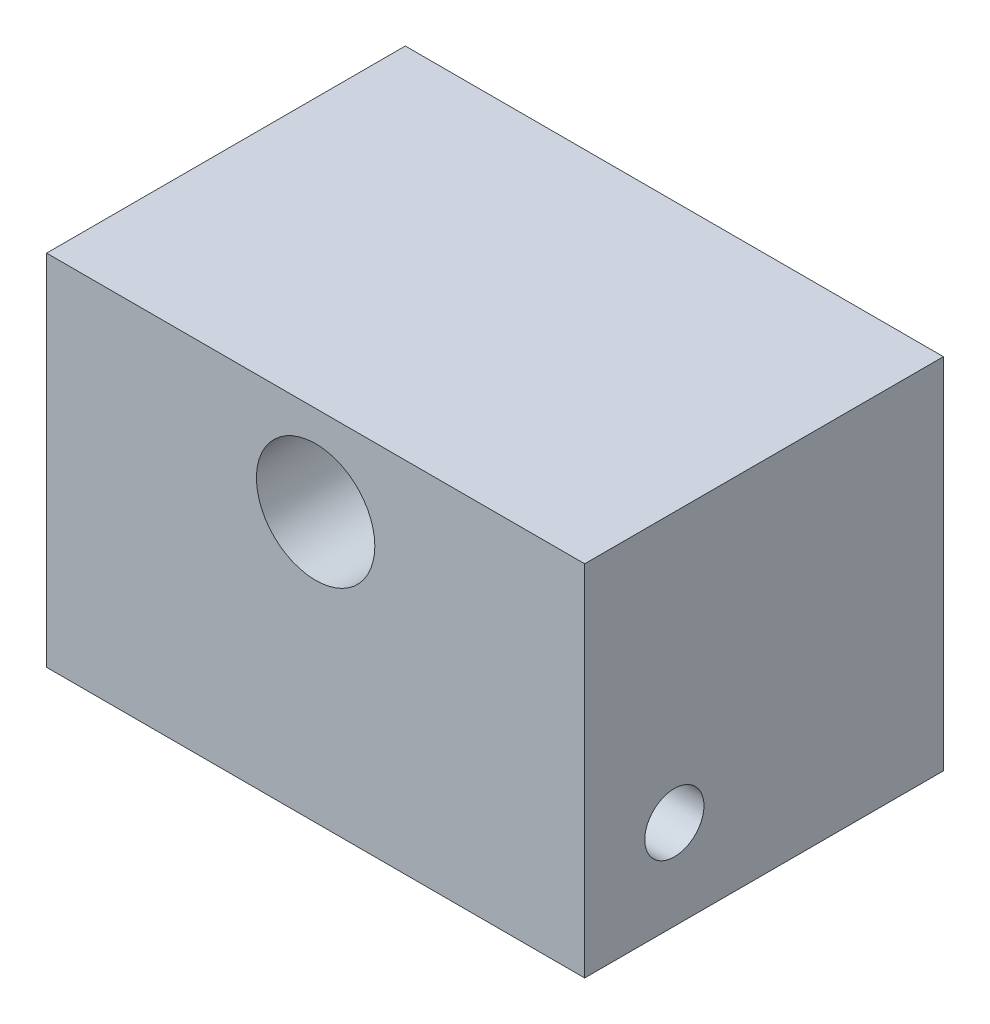
ISO-10303-21;
HEADER;
FILE_DESCRIPTION(('STEP AP214'),'2;1');
FILE_NAME('part.step','',(''),(''),'','','');
FILE_SCHEMA(('AUTOMOTIVE_DESIGN { 1 0 10303 214 1 1 1 1 }'));
ENDSEC;
DATA;
#1=APPLICATION_CONTEXT('core data for automotive mechanical design processes');
#2=APPLICATION_PROTOCOL_DEFINITION('international standard','automotive_design',2000,#1);
#3=PRODUCT_CONTEXT('',#1,'mechanical');
#4=PRODUCT('Part','Part','',(#3));
#5=PRODUCT_RELATED_PRODUCT_CATEGORY('part','',(#4));
#6=PRODUCT_DEFINITION_FORMATION('','',#4);
#7=PRODUCT_DEFINITION_CONTEXT('part definition',#1,'design');
#8=PRODUCT_DEFINITION('design','',#6,#7);
#9=PRODUCT_DEFINITION_SHAPE('','',#8);
#10=(LENGTH_UNIT() NAMED_UNIT(*) SI_UNIT(.MILLI.,.METRE.));
#11=(NAMED_UNIT(*) PLANE_ANGLE_UNIT() SI_UNIT($,.RADIAN.));
#12=(NAMED_UNIT(*) SI_UNIT($,.STERADIAN.) SOLID_ANGLE_UNIT());
#13=UNCERTAINTY_MEASURE_WITH_UNIT(LENGTH_MEASURE(1.E-05),#10,'distance_accuracy_value','');
#14=(GEOMETRIC_REPRESENTATION_CONTEXT(3) GLOBAL_UNCERTAINTY_ASSIGNED_CONTEXT((#13)) GLOBAL_UNIT_ASSIGNED_CONTEXT((#10,
#11,#12)) REPRESENTATION_CONTEXT('',''));
#15=CARTESIAN_POINT('',(0.,0.,0.));
#16=DIRECTION('',(0.,0.,1.));
#17=DIRECTION('',(1.,0.,0.));
#18=AXIS2_PLACEMENT_3D('',#15,#16,#17);
#19=CARTESIAN_POINT('',(0.,0.,20.));
#20=DIRECTION('',(1.,0.,0.));
#21=DIRECTION('',(0.,0.,-1.));
#22=AXIS2_PLACEMENT_3D('',#19,#20,#21);
#23=PLANE('',#22);
#24=CARTESIAN_POINT('',(0.,5.,15.));
#25=DIRECTION('',(-1.,0.,0.));
#26=DIRECTION('',(0.,0.,1.));
#27=AXIS2_PLACEMENT_3D('',#24,#25,#26);
#28=CIRCLE('',#27,1.65);
#29=CARTESIAN_POINT('',(0.,5.,16.65));
#30=VERTEX_POINT('',#29);
#31=EDGE_CURVE('E190',#30,#30,#28,.T.);
#32=ORIENTED_EDGE('',*,*,#31,.F.);
#33=EDGE_LOOP('',(#32));
#34=FACE_BOUND('',#33,.T.);
#35=DIRECTION('',(0.,-1.,0.));
#36=VECTOR('',#35,1.);
#37=CARTESIAN_POINT('',(0.,0.,0.));
#38=LINE('',#37,#36);
#39=CARTESIAN_POINT('',(0.,20.,0.));
#40=VERTEX_POINT('',#39);
#41=CARTESIAN_POINT('',(0.,0.,0.));
#42=VERTEX_POINT('',#41);
#43=EDGE_CURVE('E132',#40,#42,#38,.T.);
#44=ORIENTED_EDGE('',*,*,#43,.T.);
#45=DIRECTION('',(0.,0.,-1.));
#46=VECTOR('',#45,1.);
#47=CARTESIAN_POINT('',(0.,0.,20.));
#48=LINE('',#47,#46);
#49=CARTESIAN_POINT('',(0.,0.,20.));
#50=VERTEX_POINT('',#49);
#51=EDGE_CURVE('E11',#50,#42,#48,.T.);
#52=ORIENTED_EDGE('',*,*,#51,.F.);
#53=DIRECTION('',(0.,-1.,0.));
#54=VECTOR('',#53,1.);
#55=CARTESIAN_POINT('',(0.,0.,20.));
#56=LINE('',#55,#54);
#57=CARTESIAN_POINT('',(0.,20.,20.));
#58=VERTEX_POINT('',#57);
#59=EDGE_CURVE('E133',#58,#50,#56,.T.);
#60=ORIENTED_EDGE('',*,*,#59,.F.);
#61=DIRECTION('',(0.,0.,-1.));
#62=VECTOR('',#61,1.);
#63=CARTESIAN_POINT('',(0.,20.,20.));
#64=LINE('',#63,#62);
#65=EDGE_CURVE('E143',#58,#40,#64,.T.);
#66=ORIENTED_EDGE('',*,*,#65,.T.);
#67=EDGE_LOOP('',(#44,#52,#60,#66));
#68=FACE_BOUND('',#67,.T.);
#69=ADVANCED_FACE('F49',(#34,#68),#23,.F.);
#70=CARTESIAN_POINT('',(0.,0.,20.));
#71=DIRECTION('',(0.,1.,0.));
#72=DIRECTION('',(0.,0.,1.));
#73=AXIS2_PLACEMENT_3D('',#70,#71,#72);
#74=PLANE('',#73);
#75=CARTESIAN_POINT('',(22.5,0.,7.5));
#76=DIRECTION('',(0.,-1.,0.));
#77=DIRECTION('',(0.,0.,-1.));
#78=AXIS2_PLACEMENT_3D('',#75,#76,#77);
#79=CIRCLE('',#78,1.65);
#80=CARTESIAN_POINT('',(22.5,0.,5.85));
#81=VERTEX_POINT('',#80);
#82=EDGE_CURVE('E117',#81,#81,#79,.T.);
#83=ORIENTED_EDGE('',*,*,#82,.F.);
#84=EDGE_LOOP('',(#83));
#85=FACE_BOUND('',#84,.T.);
#86=CARTESIAN_POINT('',(7.5,0.,7.5));
#87=DIRECTION('',(0.,-1.,0.));
#88=DIRECTION('',(0.,0.,-1.));
#89=AXIS2_PLACEMENT_3D('',#86,#87,#88);
#90=CIRCLE('',#89,1.65);
#91=CARTESIAN_POINT('',(7.5,0.,5.85));
#92=VERTEX_POINT('',#91);
#93=EDGE_CURVE('E116',#92,#92,#90,.T.);
#94=ORIENTED_EDGE('',*,*,#93,.F.);
#95=EDGE_LOOP('',(#94));
#96=FACE_BOUND('',#95,.T.);
#97=DIRECTION('',(1.,0.,0.));
#98=VECTOR('',#97,1.);
#99=CARTESIAN_POINT('',(0.,0.,0.));
#100=LINE('',#99,#98);
#101=CARTESIAN_POINT('',(30.,0.,0.));
#102=VERTEX_POINT('',#101);
#103=EDGE_CURVE('E147',#42,#102,#100,.T.);
#104=ORIENTED_EDGE('',*,*,#103,.T.);
#105=DIRECTION('',(0.,0.,-1.));
#106=VECTOR('',#105,1.);
#107=CARTESIAN_POINT('',(30.,0.,20.));
#108=LINE('',#107,#106);
#109=CARTESIAN_POINT('',(30.,0.,20.));
#110=VERTEX_POINT('',#109);
#111=EDGE_CURVE('E59',#110,#102,#108,.T.);
#112=ORIENTED_EDGE('',*,*,#111,.F.);
#113=DIRECTION('',(1.,0.,0.));
#114=VECTOR('',#113,1.);
#115=CARTESIAN_POINT('',(0.,0.,20.));
#116=LINE('',#115,#114);
#117=EDGE_CURVE('E98',#50,#110,#116,.T.);
#118=ORIENTED_EDGE('',*,*,#117,.F.);
#119=ORIENTED_EDGE('',*,*,#51,.T.);
#120=EDGE_LOOP('',(#104,#112,#118,#119));
#121=FACE_BOUND('',#120,.T.);
#122=ADVANCED_FACE('F178',(#85,#96,#121),#74,.F.);
#123=CARTESIAN_POINT('',(30.,0.,20.));
#124=DIRECTION('',(-1.,0.,0.));
#125=DIRECTION('',(0.,0.,1.));
#126=AXIS2_PLACEMENT_3D('',#123,#124,#125);
#127=PLANE('',#126);
#128=CARTESIAN_POINT('',(30.,5.,15.));
#129=DIRECTION('',(1.,0.,0.));
#130=DIRECTION('',(0.,0.,-1.));
#131=AXIS2_PLACEMENT_3D('',#128,#129,#130);
#132=CIRCLE('',#131,1.65);
#133=CARTESIAN_POINT('',(30.,5.,13.35));
#134=VERTEX_POINT('',#133);
#135=EDGE_CURVE('E199',#134,#134,#132,.T.);
#136=ORIENTED_EDGE('',*,*,#135,.F.);
#137=EDGE_LOOP('',(#136));
#138=FACE_BOUND('',#137,.T.);
#139=DIRECTION('',(0.,1.,0.));
#140=VECTOR('',#139,1.);
#141=CARTESIAN_POINT('',(30.,0.,0.));
#142=LINE('',#141,#140);
#143=CARTESIAN_POINT('',(30.,20.,0.));
#144=VERTEX_POINT('',#143);
#145=EDGE_CURVE('E85',#102,#144,#142,.T.);
#146=ORIENTED_EDGE('',*,*,#145,.T.);
#147=DIRECTION('',(0.,0.,-1.));
#148=VECTOR('',#147,1.);
#149=CARTESIAN_POINT('',(30.,20.,20.));
#150=LINE('',#149,#148);
#151=CARTESIAN_POINT('',(30.,20.,20.));
#152=VERTEX_POINT('',#151);
#153=EDGE_CURVE('E156',#152,#144,#150,.T.);
#154=ORIENTED_EDGE('',*,*,#153,.F.);
#155=DIRECTION('',(0.,1.,0.));
#156=VECTOR('',#155,1.);
#157=CARTESIAN_POINT('',(30.,0.,20.));
#158=LINE('',#157,#156);
#159=EDGE_CURVE('E138',#110,#152,#158,.T.);
#160=ORIENTED_EDGE('',*,*,#159,.F.);
#161=ORIENTED_EDGE('',*,*,#111,.T.);
#162=EDGE_LOOP('',(#146,#154,#160,#161));
#163=FACE_BOUND('',#162,.T.);
#164=ADVANCED_FACE('F161',(#138,#163),#127,.F.);
#165=CARTESIAN_POINT('',(0.,20.,20.));
#166=DIRECTION('',(0.,-1.,0.));
#167=DIRECTION('',(0.,0.,-1.));
#168=AXIS2_PLACEMENT_3D('',#165,#166,#167);
#169=PLANE('',#168);
#170=DIRECTION('',(-1.,0.,0.));
#171=VECTOR('',#170,1.);
#172=CARTESIAN_POINT('',(0.,20.,0.));
#173=LINE('',#172,#171);
#174=EDGE_CURVE('E91',#144,#40,#173,.T.);
#175=ORIENTED_EDGE('',*,*,#174,.T.);
#176=ORIENTED_EDGE('',*,*,#65,.F.);
#177=DIRECTION('',(-1.,0.,0.));
#178=VECTOR('',#177,1.);
#179=CARTESIAN_POINT('',(0.,20.,20.));
#180=LINE('',#179,#178);
#181=EDGE_CURVE('E67',#152,#58,#180,.T.);
#182=ORIENTED_EDGE('',*,*,#181,.F.);
#183=ORIENTED_EDGE('',*,*,#153,.T.);
#184=EDGE_LOOP('',(#175,#176,#182,#183));
#185=FACE_BOUND('',#184,.T.);
#186=ADVANCED_FACE('F168',(#185),#169,.F.);
#187=CARTESIAN_POINT('',(0.,0.,20.));
#188=DIRECTION('',(0.,0.,-1.));
#189=DIRECTION('',(-1.,0.,0.));
#190=AXIS2_PLACEMENT_3D('',#187,#188,#189);
#191=PLANE('',#190);
#192=CARTESIAN_POINT('',(15.,15.,20.));
#193=DIRECTION('',(0.,0.,1.));
#194=DIRECTION('',(1.,0.,0.));
#195=AXIS2_PLACEMENT_3D('',#192,#193,#194);
#196=CIRCLE('',#195,3.29999999999999);
#197=CARTESIAN_POINT('',(18.3,15.,20.));
#198=VERTEX_POINT('',#197);
#199=EDGE_CURVE('E207',#198,#198,#196,.T.);
#200=ORIENTED_EDGE('',*,*,#199,.F.);
#201=EDGE_LOOP('',(#200));
#202=FACE_BOUND('',#201,.T.);
#203=ORIENTED_EDGE('',*,*,#59,.T.);
#204=ORIENTED_EDGE('',*,*,#117,.T.);
#205=ORIENTED_EDGE('',*,*,#159,.T.);
#206=ORIENTED_EDGE('',*,*,#181,.T.);
#207=EDGE_LOOP('',(#203,#204,#205,#206));
#208=FACE_BOUND('',#207,.T.);
#209=ADVANCED_FACE('F170',(#202,#208),#191,.F.);
#210=CARTESIAN_POINT('',(0.,0.,0.));
#211=DIRECTION('',(0.,0.,-1.));
#212=DIRECTION('',(-1.,0.,0.));
#213=AXIS2_PLACEMENT_3D('',#210,#211,#212);
#214=PLANE('',#213);
#215=CARTESIAN_POINT('',(15.,15.,0.));
#216=DIRECTION('',(0.,0.,1.));
#217=DIRECTION('',(1.,0.,0.));
#218=AXIS2_PLACEMENT_3D('',#215,#216,#217);
#219=CIRCLE('',#218,3.3);
#220=CARTESIAN_POINT('',(18.3,15.,0.));
#221=VERTEX_POINT('',#220);
#222=EDGE_CURVE('E125',#221,#221,#219,.T.);
#223=ORIENTED_EDGE('',*,*,#222,.T.);
#224=EDGE_LOOP('',(#223));
#225=FACE_BOUND('',#224,.T.);
#226=ORIENTED_EDGE('',*,*,#43,.F.);
#227=ORIENTED_EDGE('',*,*,#174,.F.);
#228=ORIENTED_EDGE('',*,*,#145,.F.);
#229=ORIENTED_EDGE('',*,*,#103,.F.);
#230=EDGE_LOOP('',(#226,#227,#228,#229));
#231=FACE_BOUND('',#230,.T.);
#232=ADVANCED_FACE('F164',(#225,#231),#214,.T.);
#233=CARTESIAN_POINT('',(7.5,10.5085799786045,7.5));
#234=DIRECTION('',(0.,-1.,0.));
#235=DIRECTION('',(0.,0.,-1.));
#236=AXIS2_PLACEMENT_3D('',#233,#234,#235);
#237=CONICAL_SURFACE('',#236,1.65,1.02974425867665);
#238=CARTESIAN_POINT('',(7.5,11.5,7.5));
#239=VERTEX_POINT('',#238);
#240=VERTEX_LOOP('',#239);
#241=FACE_BOUND('',#240,.T.);
#242=CARTESIAN_POINT('',(7.5,10.5085799786045,7.5));
#243=DIRECTION('',(0.,-1.,0.));
#244=DIRECTION('',(0.,0.,-1.));
#245=AXIS2_PLACEMENT_3D('',#242,#243,#244);
#246=CIRCLE('',#245,1.65);
#247=CARTESIAN_POINT('',(7.5,10.5085799786045,5.85));
#248=VERTEX_POINT('',#247);
#249=EDGE_CURVE('E122',#248,#248,#246,.T.);
#250=ORIENTED_EDGE('',*,*,#249,.T.);
#251=EDGE_LOOP('',(#250));
#252=FACE_BOUND('',#251,.T.);
#253=ADVANCED_FACE('F233',(#241,#252),#237,.F.);
#254=CARTESIAN_POINT('',(7.5,0.,7.5));
#255=DIRECTION('',(0.,-1.,0.));
#256=DIRECTION('',(0.,0.,-1.));
#257=AXIS2_PLACEMENT_3D('',#254,#255,#256);
#258=CYLINDRICAL_SURFACE('',#257,1.65);
#259=ORIENTED_EDGE('',*,*,#249,.F.);
#260=EDGE_LOOP('',(#259));
#261=FACE_BOUND('',#260,.T.);
#262=ORIENTED_EDGE('',*,*,#93,.T.);
#263=EDGE_LOOP('',(#262));
#264=FACE_BOUND('',#263,.T.);
#265=ADVANCED_FACE('F109',(#261,#264),#258,.F.);
#266=CARTESIAN_POINT('',(22.5,10.5085799786045,7.5));
#267=DIRECTION('',(0.,-1.,0.));
#268=DIRECTION('',(0.,0.,-1.));
#269=AXIS2_PLACEMENT_3D('',#266,#267,#268);
#270=CONICAL_SURFACE('',#269,1.65,1.02974425867665);
#271=CARTESIAN_POINT('',(22.5,11.5,7.5));
#272=VERTEX_POINT('',#271);
#273=VERTEX_LOOP('',#272);
#274=FACE_BOUND('',#273,.T.);
#275=CARTESIAN_POINT('',(22.5,10.5085799786045,7.5));
#276=DIRECTION('',(0.,-1.,0.));
#277=DIRECTION('',(0.,0.,-1.));
#278=AXIS2_PLACEMENT_3D('',#275,#276,#277);
#279=CIRCLE('',#278,1.65);
#280=CARTESIAN_POINT('',(22.5,10.5085799786045,5.85));
#281=VERTEX_POINT('',#280);
#282=EDGE_CURVE('E113',#281,#281,#279,.T.);
#283=ORIENTED_EDGE('',*,*,#282,.T.);
#284=EDGE_LOOP('',(#283));
#285=FACE_BOUND('',#284,.T.);
#286=ADVANCED_FACE('F105',(#274,#285),#270,.F.);
#287=CARTESIAN_POINT('',(22.5,0.,7.5));
#288=DIRECTION('',(0.,-1.,0.));
#289=DIRECTION('',(0.,0.,-1.));
#290=AXIS2_PLACEMENT_3D('',#287,#288,#289);
#291=CYLINDRICAL_SURFACE('',#290,1.65);
#292=ORIENTED_EDGE('',*,*,#282,.F.);
#293=EDGE_LOOP('',(#292));
#294=FACE_BOUND('',#293,.T.);
#295=ORIENTED_EDGE('',*,*,#82,.T.);
#296=EDGE_LOOP('',(#295));
#297=FACE_BOUND('',#296,.T.);
#298=ADVANCED_FACE('F108',(#294,#297),#291,.F.);
#299=CARTESIAN_POINT('',(15.,15.,20.));
#300=DIRECTION('',(0.,0.,1.));
#301=DIRECTION('',(1.,0.,0.));
#302=AXIS2_PLACEMENT_3D('',#299,#300,#301);
#303=CYLINDRICAL_SURFACE('',#302,3.29999999999999);
#304=ORIENTED_EDGE('',*,*,#222,.F.);
#305=EDGE_LOOP('',(#304));
#306=FACE_BOUND('',#305,.T.);
#307=ORIENTED_EDGE('',*,*,#199,.T.);
#308=EDGE_LOOP('',(#307));
#309=FACE_BOUND('',#308,.T.);
#310=ADVANCED_FACE('F215',(#306,#309),#303,.F.);
#311=CARTESIAN_POINT('',(15.9914200213955,5.,15.));
#312=DIRECTION('',(1.,0.,0.));
#313=DIRECTION('',(0.,0.,-1.));
#314=AXIS2_PLACEMENT_3D('',#311,#312,#313);
#315=CONICAL_SURFACE('',#314,1.65,1.02974425867665);
#316=CARTESIAN_POINT('',(15.4957100106977,5.,15.));
#317=DIRECTION('',(-1.,0.,0.));
#318=DIRECTION('',(0.,0.,1.));
#319=AXIS2_PLACEMENT_3D('',#316,#317,#318);
#320=CIRCLE('',#319,0.824999999999999);
#321=CARTESIAN_POINT('',(15.4957100106977,5.,15.825));
#322=VERTEX_POINT('',#321);
#323=EDGE_CURVE('E52',#322,#322,#320,.T.);
#324=ORIENTED_EDGE('',*,*,#323,.T.);
#325=EDGE_LOOP('',(#324));
#326=FACE_BOUND('',#325,.T.);
#327=CARTESIAN_POINT('',(15.9914200213955,5.,15.));
#328=DIRECTION('',(1.,0.,0.));
#329=DIRECTION('',(0.,0.,-1.));
#330=AXIS2_PLACEMENT_3D('',#327,#328,#329);
#331=CIRCLE('',#330,1.65);
#332=CARTESIAN_POINT('',(15.9914200213955,5.,13.35));
#333=VERTEX_POINT('',#332);
#334=EDGE_CURVE('E203',#333,#333,#331,.T.);
#335=ORIENTED_EDGE('',*,*,#334,.T.);
#336=EDGE_LOOP('',(#335));
#337=FACE_BOUND('',#336,.T.);
#338=ADVANCED_FACE('F218',(#326,#337),#315,.F.);
#339=CARTESIAN_POINT('',(30.,5.,15.));
#340=DIRECTION('',(1.,0.,0.));
#341=DIRECTION('',(0.,0.,-1.));
#342=AXIS2_PLACEMENT_3D('',#339,#340,#341);
#343=CYLINDRICAL_SURFACE('',#342,1.65);
#344=ORIENTED_EDGE('',*,*,#334,.F.);
#345=EDGE_LOOP('',(#344));
#346=FACE_BOUND('',#345,.T.);
#347=ORIENTED_EDGE('',*,*,#135,.T.);
#348=EDGE_LOOP('',(#347));
#349=FACE_BOUND('',#348,.T.);
#350=ADVANCED_FACE('F225',(#346,#349),#343,.F.);
#351=CARTESIAN_POINT('',(15.,5.,15.));
#352=DIRECTION('',(-1.,0.,0.));
#353=DIRECTION('',(0.,0.,1.));
#354=AXIS2_PLACEMENT_3D('',#351,#352,#353);
#355=CONICAL_SURFACE('',#354,1.65,1.02974425867665);
#356=CARTESIAN_POINT('',(15.,5.,15.));
#357=DIRECTION('',(-1.,0.,0.));
#358=DIRECTION('',(0.,0.,1.));
#359=AXIS2_PLACEMENT_3D('',#356,#357,#358);
#360=CIRCLE('',#359,1.65);
#361=CARTESIAN_POINT('',(15.,5.,16.65));
#362=VERTEX_POINT('',#361);
#363=EDGE_CURVE('E193',#362,#362,#360,.T.);
#364=ORIENTED_EDGE('',*,*,#363,.T.);
#365=EDGE_LOOP('',(#364));
#366=FACE_BOUND('',#365,.T.);
#367=ORIENTED_EDGE('',*,*,#323,.F.);
#368=EDGE_LOOP('',(#367));
#369=FACE_BOUND('',#368,.T.);
#370=ADVANCED_FACE('F287',(#366,#369),#355,.F.);
#371=CARTESIAN_POINT('',(0.,5.,15.));
#372=DIRECTION('',(-1.,0.,0.));
#373=DIRECTION('',(0.,0.,1.));
#374=AXIS2_PLACEMENT_3D('',#371,#372,#373);
#375=CYLINDRICAL_SURFACE('',#374,1.65);
#376=ORIENTED_EDGE('',*,*,#363,.F.);
#377=EDGE_LOOP('',(#376));
#378=FACE_BOUND('',#377,.T.);
#379=ORIENTED_EDGE('',*,*,#31,.T.);
#380=EDGE_LOOP('',(#379));
#381=FACE_BOUND('',#380,.T.);
#382=ADVANCED_FACE('F291',(#378,#381),#375,.F.);
#383=CLOSED_SHELL('',(#69,#122,#164,#186,#209,#232,#253,#265,#286,#298,#310,#338,#350,#370,#382));
#384=MANIFOLD_SOLID_BREP('B2',#383);
#385=ADVANCED_BREP_SHAPE_REPRESENTATION('',(#18,#384),#14);
#386=SHAPE_DEFINITION_REPRESENTATION(#9,#385);
ENDSEC;
END-ISO-10303-21;
